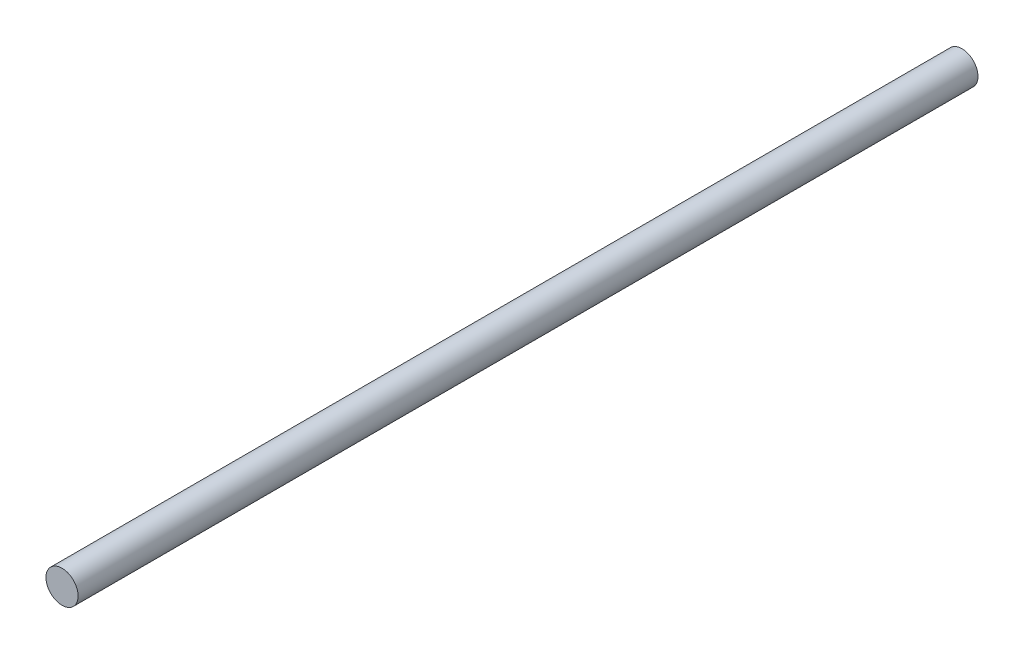
ISO-10303-21;
HEADER;
FILE_DESCRIPTION(('STEP AP214'),'2;1');
FILE_NAME('part.step','',(''),(''),'','','');
FILE_SCHEMA(('AUTOMOTIVE_DESIGN { 1 0 10303 214 1 1 1 1 }'));
ENDSEC;
DATA;
#1=APPLICATION_CONTEXT('core data for automotive mechanical design processes');
#2=APPLICATION_PROTOCOL_DEFINITION('international standard','automotive_design',2000,#1);
#3=PRODUCT_CONTEXT('',#1,'mechanical');
#4=PRODUCT('Part','Part','',(#3));
#5=PRODUCT_RELATED_PRODUCT_CATEGORY('part','',(#4));
#6=PRODUCT_DEFINITION_FORMATION('','',#4);
#7=PRODUCT_DEFINITION_CONTEXT('part definition',#1,'design');
#8=PRODUCT_DEFINITION('design','',#6,#7);
#9=PRODUCT_DEFINITION_SHAPE('','',#8);
#10=(LENGTH_UNIT() NAMED_UNIT(*) SI_UNIT(.MILLI.,.METRE.));
#11=(NAMED_UNIT(*) PLANE_ANGLE_UNIT() SI_UNIT($,.RADIAN.));
#12=(NAMED_UNIT(*) SI_UNIT($,.STERADIAN.) SOLID_ANGLE_UNIT());
#13=UNCERTAINTY_MEASURE_WITH_UNIT(LENGTH_MEASURE(1.E-05),#10,'distance_accuracy_value','');
#14=(GEOMETRIC_REPRESENTATION_CONTEXT(3) GLOBAL_UNCERTAINTY_ASSIGNED_CONTEXT((#13)) GLOBAL_UNIT_ASSIGNED_CONTEXT((#10,
#11,#12)) REPRESENTATION_CONTEXT('',''));
#15=CARTESIAN_POINT('',(0.,0.,0.));
#16=DIRECTION('',(0.,0.,1.));
#17=DIRECTION('',(1.,0.,0.));
#18=AXIS2_PLACEMENT_3D('',#15,#16,#17);
#19=CARTESIAN_POINT('',(0.,0.,700.));
#20=DIRECTION('',(0.,0.,-1.));
#21=DIRECTION('',(-1.,0.,0.));
#22=AXIS2_PLACEMENT_3D('',#19,#20,#21);
#23=CYLINDRICAL_SURFACE('',#22,12.5);
#24=CARTESIAN_POINT('',(0.,0.,700.));
#25=DIRECTION('',(0.,0.,1.));
#26=DIRECTION('',(1.,0.,0.));
#27=AXIS2_PLACEMENT_3D('',#24,#25,#26);
#28=CIRCLE('',#27,12.5);
#29=CARTESIAN_POINT('',(12.5,0.,700.));
#30=VERTEX_POINT('',#29);
#31=EDGE_CURVE('E10',#30,#30,#28,.T.);
#32=ORIENTED_EDGE('',*,*,#31,.F.);
#33=EDGE_LOOP('',(#32));
#34=FACE_BOUND('',#33,.T.);
#35=CARTESIAN_POINT('',(0.,0.,0.));
#36=DIRECTION('',(0.,0.,1.));
#37=DIRECTION('',(1.,0.,0.));
#38=AXIS2_PLACEMENT_3D('',#35,#36,#37);
#39=CIRCLE('',#38,12.5);
#40=CARTESIAN_POINT('',(12.5,0.,0.));
#41=VERTEX_POINT('',#40);
#42=EDGE_CURVE('E36',#41,#41,#39,.T.);
#43=ORIENTED_EDGE('',*,*,#42,.T.);
#44=EDGE_LOOP('',(#43));
#45=FACE_BOUND('',#44,.T.);
#46=ADVANCED_FACE('F33',(#34,#45),#23,.T.);
#47=CARTESIAN_POINT('',(0.,0.,700.));
#48=DIRECTION('',(0.,0.,1.));
#49=DIRECTION('',(1.,0.,0.));
#50=AXIS2_PLACEMENT_3D('',#47,#48,#49);
#51=PLANE('',#50);
#52=ORIENTED_EDGE('',*,*,#31,.T.);
#53=EDGE_LOOP('',(#52));
#54=FACE_BOUND('',#53,.T.);
#55=ADVANCED_FACE('F48',(#54),#51,.T.);
#56=CARTESIAN_POINT('',(0.,0.,0.));
#57=DIRECTION('',(0.,0.,1.));
#58=DIRECTION('',(1.,0.,0.));
#59=AXIS2_PLACEMENT_3D('',#56,#57,#58);
#60=PLANE('',#59);
#61=ORIENTED_EDGE('',*,*,#42,.F.);
#62=EDGE_LOOP('',(#61));
#63=FACE_BOUND('',#62,.T.);
#64=ADVANCED_FACE('F46',(#63),#60,.F.);
#65=CLOSED_SHELL('',(#46,#55,#64));
#66=MANIFOLD_SOLID_BREP('B2',#65);
#67=ADVANCED_BREP_SHAPE_REPRESENTATION('',(#18,#66),#14);
#68=SHAPE_DEFINITION_REPRESENTATION(#9,#67);
ENDSEC;
END-ISO-10303-21;
